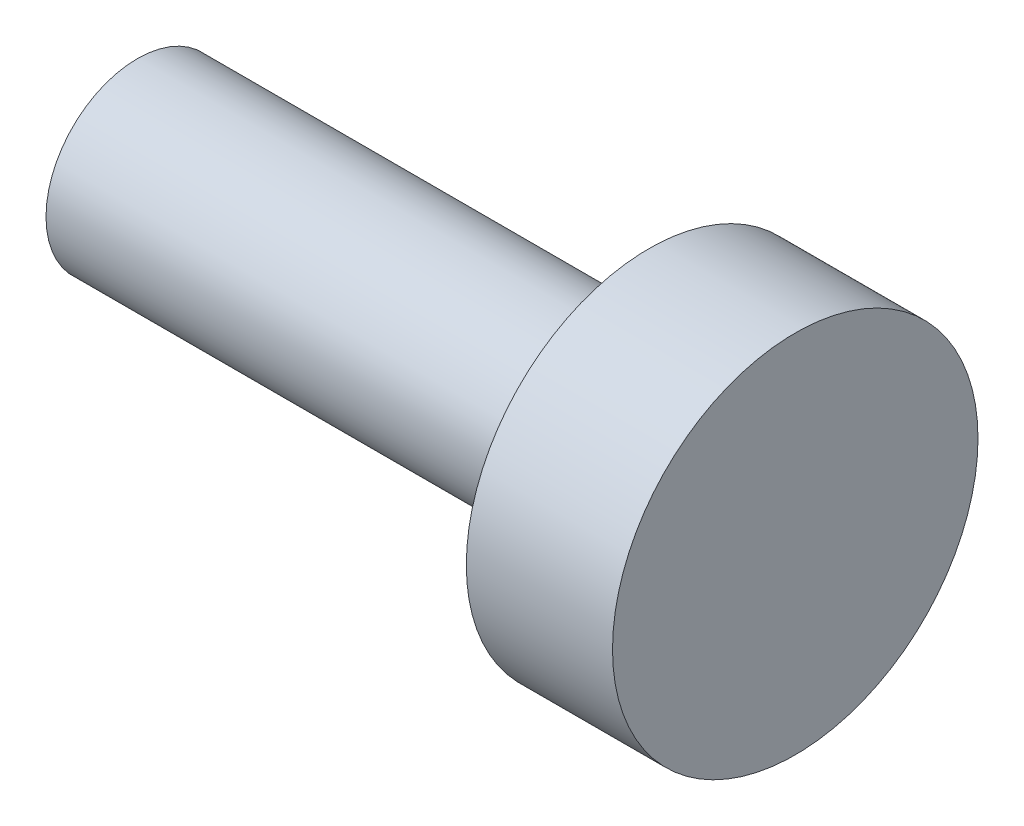
ISO-10303-21;
HEADER;
FILE_DESCRIPTION(('STEP AP214'),'2;1');
FILE_NAME('part.step','',(''),(''),'','','');
FILE_SCHEMA(('AUTOMOTIVE_DESIGN { 1 0 10303 214 1 1 1 1 }'));
ENDSEC;
DATA;
#1=APPLICATION_CONTEXT('core data for automotive mechanical design processes');
#2=APPLICATION_PROTOCOL_DEFINITION('international standard','automotive_design',2000,#1);
#3=PRODUCT_CONTEXT('',#1,'mechanical');
#4=PRODUCT('Part','Part','',(#3));
#5=PRODUCT_RELATED_PRODUCT_CATEGORY('part','',(#4));
#6=PRODUCT_DEFINITION_FORMATION('','',#4);
#7=PRODUCT_DEFINITION_CONTEXT('part definition',#1,'design');
#8=PRODUCT_DEFINITION('design','',#6,#7);
#9=PRODUCT_DEFINITION_SHAPE('','',#8);
#10=(LENGTH_UNIT() NAMED_UNIT(*) SI_UNIT(.MILLI.,.METRE.));
#11=(NAMED_UNIT(*) PLANE_ANGLE_UNIT() SI_UNIT($,.RADIAN.));
#12=(NAMED_UNIT(*) SI_UNIT($,.STERADIAN.) SOLID_ANGLE_UNIT());
#13=UNCERTAINTY_MEASURE_WITH_UNIT(LENGTH_MEASURE(1.E-05),#10,'distance_accuracy_value','');
#14=(GEOMETRIC_REPRESENTATION_CONTEXT(3) GLOBAL_UNCERTAINTY_ASSIGNED_CONTEXT((#13)) GLOBAL_UNIT_ASSIGNED_CONTEXT((#10,
#11,#12)) REPRESENTATION_CONTEXT('',''));
#15=CARTESIAN_POINT('',(0.,0.,0.));
#16=DIRECTION('',(0.,0.,1.));
#17=DIRECTION('',(1.,0.,0.));
#18=AXIS2_PLACEMENT_3D('',#15,#16,#17);
#19=CARTESIAN_POINT('',(0.,3.175,0.));
#20=DIRECTION('',(1.,0.,0.));
#21=DIRECTION('',(0.,0.,-1.));
#22=AXIS2_PLACEMENT_3D('',#19,#20,#21);
#23=PLANE('',#22);
#24=CARTESIAN_POINT('',(0.,0.,0.));
#25=DIRECTION('',(-1.,0.,0.));
#26=DIRECTION('',(0.,0.,1.));
#27=AXIS2_PLACEMENT_3D('',#24,#25,#26);
#28=CIRCLE('',#27,3.175);
#29=CARTESIAN_POINT('',(0.,0.,3.175));
#30=VERTEX_POINT('',#29);
#31=EDGE_CURVE('E48',#30,#30,#28,.T.);
#32=ORIENTED_EDGE('',*,*,#31,.T.);
#33=EDGE_LOOP('',(#32));
#34=FACE_BOUND('',#33,.T.);
#35=ADVANCED_FACE('F34',(#34),#23,.F.);
#36=CARTESIAN_POINT('',(22.86,0.,0.));
#37=DIRECTION('',(-1.,0.,0.));
#38=DIRECTION('',(0.,0.,1.));
#39=AXIS2_PLACEMENT_3D('',#36,#37,#38);
#40=PLANE('',#39);
#41=CARTESIAN_POINT('',(22.86,0.,0.));
#42=DIRECTION('',(-1.,0.,0.));
#43=DIRECTION('',(0.,0.,1.));
#44=AXIS2_PLACEMENT_3D('',#41,#42,#43);
#45=CIRCLE('',#44,6.35);
#46=CARTESIAN_POINT('',(22.86,0.,6.35));
#47=VERTEX_POINT('',#46);
#48=EDGE_CURVE('E10',#47,#47,#45,.T.);
#49=ORIENTED_EDGE('',*,*,#48,.F.);
#50=EDGE_LOOP('',(#49));
#51=FACE_BOUND('',#50,.T.);
#52=ADVANCED_FACE('F68',(#51),#40,.F.);
#53=CARTESIAN_POINT('',(0.,0.,0.));
#54=DIRECTION('',(-1.,0.,0.));
#55=DIRECTION('',(0.,0.,1.));
#56=AXIS2_PLACEMENT_3D('',#53,#54,#55);
#57=CYLINDRICAL_SURFACE('',#56,6.35);
#58=CARTESIAN_POINT('',(17.78,0.,0.));
#59=DIRECTION('',(-1.,0.,0.));
#60=DIRECTION('',(0.,0.,1.));
#61=AXIS2_PLACEMENT_3D('',#58,#59,#60);
#62=CIRCLE('',#61,6.35);
#63=CARTESIAN_POINT('',(17.78,0.,6.35));
#64=VERTEX_POINT('',#63);
#65=EDGE_CURVE('E40',#64,#64,#62,.T.);
#66=ORIENTED_EDGE('',*,*,#65,.F.);
#67=EDGE_LOOP('',(#66));
#68=FACE_BOUND('',#67,.T.);
#69=ORIENTED_EDGE('',*,*,#48,.T.);
#70=EDGE_LOOP('',(#69));
#71=FACE_BOUND('',#70,.T.);
#72=ADVANCED_FACE('F63',(#68,#71),#57,.T.);
#73=CARTESIAN_POINT('',(17.78,6.35,0.));
#74=DIRECTION('',(1.,0.,0.));
#75=DIRECTION('',(0.,0.,-1.));
#76=AXIS2_PLACEMENT_3D('',#73,#74,#75);
#77=PLANE('',#76);
#78=CARTESIAN_POINT('',(17.78,0.,0.));
#79=DIRECTION('',(-1.,0.,0.));
#80=DIRECTION('',(0.,0.,1.));
#81=AXIS2_PLACEMENT_3D('',#78,#79,#80);
#82=CIRCLE('',#81,3.175);
#83=CARTESIAN_POINT('',(17.78,0.,3.175));
#84=VERTEX_POINT('',#83);
#85=EDGE_CURVE('E44',#84,#84,#82,.T.);
#86=ORIENTED_EDGE('',*,*,#85,.F.);
#87=EDGE_LOOP('',(#86));
#88=FACE_BOUND('',#87,.T.);
#89=ORIENTED_EDGE('',*,*,#65,.T.);
#90=EDGE_LOOP('',(#89));
#91=FACE_BOUND('',#90,.T.);
#92=ADVANCED_FACE('F58',(#88,#91),#77,.F.);
#93=CARTESIAN_POINT('',(0.,0.,0.));
#94=DIRECTION('',(-1.,0.,0.));
#95=DIRECTION('',(0.,0.,1.));
#96=AXIS2_PLACEMENT_3D('',#93,#94,#95);
#97=CYLINDRICAL_SURFACE('',#96,3.175);
#98=ORIENTED_EDGE('',*,*,#31,.F.);
#99=EDGE_LOOP('',(#98));
#100=FACE_BOUND('',#99,.T.);
#101=ORIENTED_EDGE('',*,*,#85,.T.);
#102=EDGE_LOOP('',(#101));
#103=FACE_BOUND('',#102,.T.);
#104=ADVANCED_FACE('F55',(#100,#103),#97,.T.);
#105=CLOSED_SHELL('',(#35,#52,#72,#92,#104));
#106=MANIFOLD_SOLID_BREP('B2',#105);
#107=ADVANCED_BREP_SHAPE_REPRESENTATION('',(#18,#106),#14);
#108=SHAPE_DEFINITION_REPRESENTATION(#9,#107);
ENDSEC;
END-ISO-10303-21;
